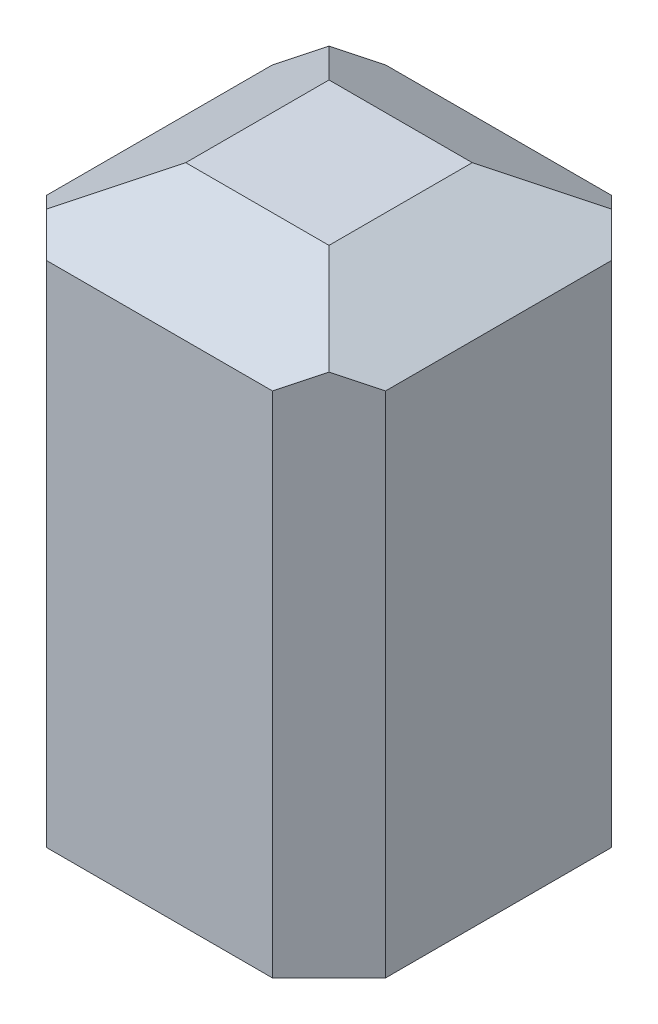
ISO-10303-21;
HEADER;
FILE_DESCRIPTION(('STEP AP214'),'2;1');
FILE_NAME('part.step','',(''),(''),'','','');
FILE_SCHEMA(('AUTOMOTIVE_DESIGN { 1 0 10303 214 1 1 1 1 }'));
ENDSEC;
DATA;
#1=APPLICATION_CONTEXT('core data for automotive mechanical design processes');
#2=APPLICATION_PROTOCOL_DEFINITION('international standard','automotive_design',2000,#1);
#3=PRODUCT_CONTEXT('',#1,'mechanical');
#4=PRODUCT('Part','Part','',(#3));
#5=PRODUCT_RELATED_PRODUCT_CATEGORY('part','',(#4));
#6=PRODUCT_DEFINITION_FORMATION('','',#4);
#7=PRODUCT_DEFINITION_CONTEXT('part definition',#1,'design');
#8=PRODUCT_DEFINITION('design','',#6,#7);
#9=PRODUCT_DEFINITION_SHAPE('','',#8);
#10=(LENGTH_UNIT() NAMED_UNIT(*) SI_UNIT(.MILLI.,.METRE.));
#11=(NAMED_UNIT(*) PLANE_ANGLE_UNIT() SI_UNIT($,.RADIAN.));
#12=(NAMED_UNIT(*) SI_UNIT($,.STERADIAN.) SOLID_ANGLE_UNIT());
#13=UNCERTAINTY_MEASURE_WITH_UNIT(LENGTH_MEASURE(1.E-05),#10,'distance_accuracy_value','');
#14=(GEOMETRIC_REPRESENTATION_CONTEXT(3) GLOBAL_UNCERTAINTY_ASSIGNED_CONTEXT((#13)) GLOBAL_UNIT_ASSIGNED_CONTEXT((#10,
#11,#12)) REPRESENTATION_CONTEXT('',''));
#15=CARTESIAN_POINT('',(0.,0.,0.));
#16=DIRECTION('',(0.,0.,1.));
#17=DIRECTION('',(1.,0.,0.));
#18=AXIS2_PLACEMENT_3D('',#15,#16,#17);
#19=CARTESIAN_POINT('',(-3.,10.,-3.));
#20=DIRECTION('',(1.,0.,0.));
#21=DIRECTION('',(0.,0.,-1.));
#22=AXIS2_PLACEMENT_3D('',#19,#20,#21);
#23=PLANE('',#22);
#24=DIRECTION('',(0.,1.,0.));
#25=VECTOR('',#24,1.);
#26=CARTESIAN_POINT('',(-3.,10.,1.99999999999999));
#27=LINE('',#26,#25);
#28=CARTESIAN_POINT('',(-3.,0.,1.99999999999999));
#29=VERTEX_POINT('',#28);
#30=CARTESIAN_POINT('',(-3.,9.,1.99999999999999));
#31=VERTEX_POINT('',#30);
#32=EDGE_CURVE('E166',#29,#31,#27,.T.);
#33=ORIENTED_EDGE('',*,*,#32,.T.);
#34=DIRECTION('',(0.,0.,-1.));
#35=VECTOR('',#34,1.);
#36=CARTESIAN_POINT('',(-3.,9.,-1.26794919243113));
#37=LINE('',#36,#35);
#38=CARTESIAN_POINT('',(-3.,9.,-2.));
#39=VERTEX_POINT('',#38);
#40=EDGE_CURVE('E47',#31,#39,#37,.T.);
#41=ORIENTED_EDGE('',*,*,#40,.T.);
#42=DIRECTION('',(0.,-1.,0.));
#43=VECTOR('',#42,1.);
#44=CARTESIAN_POINT('',(-3.,10.,-2.));
#45=LINE('',#44,#43);
#46=CARTESIAN_POINT('',(-3.,0.,-2.));
#47=VERTEX_POINT('',#46);
#48=EDGE_CURVE('E168',#39,#47,#45,.T.);
#49=ORIENTED_EDGE('',*,*,#48,.T.);
#50=DIRECTION('',(0.,0.,1.));
#51=VECTOR('',#50,1.);
#52=CARTESIAN_POINT('',(-3.,0.,-3.));
#53=LINE('',#52,#51);
#54=EDGE_CURVE('E248',#47,#29,#53,.T.);
#55=ORIENTED_EDGE('',*,*,#54,.T.);
#56=EDGE_LOOP('',(#33,#41,#49,#55));
#57=FACE_BOUND('',#56,.T.);
#58=ADVANCED_FACE('F39',(#57),#23,.F.);
#59=CARTESIAN_POINT('',(-3.,10.,3.));
#60=DIRECTION('',(0.,0.,-1.));
#61=DIRECTION('',(-1.,0.,0.));
#62=AXIS2_PLACEMENT_3D('',#59,#60,#61);
#63=PLANE('',#62);
#64=DIRECTION('',(0.,1.,0.));
#65=VECTOR('',#64,1.);
#66=CARTESIAN_POINT('',(1.99999999999999,10.,3.));
#67=LINE('',#66,#65);
#68=CARTESIAN_POINT('',(1.99999999999999,0.,3.));
#69=VERTEX_POINT('',#68);
#70=CARTESIAN_POINT('',(1.99999999999999,9.,3.));
#71=VERTEX_POINT('',#70);
#72=EDGE_CURVE('E177',#69,#71,#67,.T.);
#73=ORIENTED_EDGE('',*,*,#72,.T.);
#74=DIRECTION('',(-1.,0.,0.));
#75=VECTOR('',#74,1.);
#76=CARTESIAN_POINT('',(-1.99999999999999,9.,3.));
#77=LINE('',#76,#75);
#78=CARTESIAN_POINT('',(-1.99999999999999,9.,3.));
#79=VERTEX_POINT('',#78);
#80=EDGE_CURVE('E188',#71,#79,#77,.T.);
#81=ORIENTED_EDGE('',*,*,#80,.T.);
#82=DIRECTION('',(0.,-1.,0.));
#83=VECTOR('',#82,1.);
#84=CARTESIAN_POINT('',(-1.99999999999999,10.,3.));
#85=LINE('',#84,#83);
#86=CARTESIAN_POINT('',(-1.99999999999999,0.,3.));
#87=VERTEX_POINT('',#86);
#88=EDGE_CURVE('E164',#79,#87,#85,.T.);
#89=ORIENTED_EDGE('',*,*,#88,.T.);
#90=DIRECTION('',(1.,0.,0.));
#91=VECTOR('',#90,1.);
#92=CARTESIAN_POINT('',(-3.,0.,3.));
#93=LINE('',#92,#91);
#94=EDGE_CURVE('E157',#87,#69,#93,.T.);
#95=ORIENTED_EDGE('',*,*,#94,.T.);
#96=EDGE_LOOP('',(#73,#81,#89,#95));
#97=FACE_BOUND('',#96,.T.);
#98=ADVANCED_FACE('F245',(#97),#63,.F.);
#99=CARTESIAN_POINT('',(3.,10.,-3.));
#100=DIRECTION('',(-1.,0.,0.));
#101=DIRECTION('',(0.,0.,1.));
#102=AXIS2_PLACEMENT_3D('',#99,#100,#101);
#103=PLANE('',#102);
#104=DIRECTION('',(0.,1.,0.));
#105=VECTOR('',#104,1.);
#106=CARTESIAN_POINT('',(3.,10.,-2.));
#107=LINE('',#106,#105);
#108=CARTESIAN_POINT('',(3.,0.,-2.));
#109=VERTEX_POINT('',#108);
#110=CARTESIAN_POINT('',(3.,9.,-2.));
#111=VERTEX_POINT('',#110);
#112=EDGE_CURVE('E147',#109,#111,#107,.T.);
#113=ORIENTED_EDGE('',*,*,#112,.T.);
#114=DIRECTION('',(0.,0.,1.));
#115=VECTOR('',#114,1.);
#116=CARTESIAN_POINT('',(3.,9.,1.26794919243112));
#117=LINE('',#116,#115);
#118=CARTESIAN_POINT('',(3.,9.,1.99999999999999));
#119=VERTEX_POINT('',#118);
#120=EDGE_CURVE('E209',#111,#119,#117,.T.);
#121=ORIENTED_EDGE('',*,*,#120,.T.);
#122=DIRECTION('',(0.,-1.,0.));
#123=VECTOR('',#122,1.);
#124=CARTESIAN_POINT('',(3.,10.,1.99999999999999));
#125=LINE('',#124,#123);
#126=CARTESIAN_POINT('',(3.,0.,1.99999999999999));
#127=VERTEX_POINT('',#126);
#128=EDGE_CURVE('E175',#119,#127,#125,.T.);
#129=ORIENTED_EDGE('',*,*,#128,.T.);
#130=DIRECTION('',(0.,0.,-1.));
#131=VECTOR('',#130,1.);
#132=CARTESIAN_POINT('',(3.,0.,-3.));
#133=LINE('',#132,#131);
#134=EDGE_CURVE('E155',#127,#109,#133,.T.);
#135=ORIENTED_EDGE('',*,*,#134,.T.);
#136=EDGE_LOOP('',(#113,#121,#129,#135));
#137=FACE_BOUND('',#136,.T.);
#138=ADVANCED_FACE('F236',(#137),#103,.F.);
#139=CARTESIAN_POINT('',(-3.,10.,-3.));
#140=DIRECTION('',(0.,0.,1.));
#141=DIRECTION('',(1.,0.,0.));
#142=AXIS2_PLACEMENT_3D('',#139,#140,#141);
#143=PLANE('',#142);
#144=DIRECTION('',(0.,1.,0.));
#145=VECTOR('',#144,1.);
#146=CARTESIAN_POINT('',(-1.99999999999999,10.,-3.));
#147=LINE('',#146,#145);
#148=CARTESIAN_POINT('',(-1.99999999999999,0.,-3.));
#149=VERTEX_POINT('',#148);
#150=CARTESIAN_POINT('',(-1.99999999999999,9.,-3.));
#151=VERTEX_POINT('',#150);
#152=EDGE_CURVE('E173',#149,#151,#147,.T.);
#153=ORIENTED_EDGE('',*,*,#152,.T.);
#154=DIRECTION('',(1.,0.,0.));
#155=VECTOR('',#154,1.);
#156=CARTESIAN_POINT('',(2.,9.,-3.));
#157=LINE('',#156,#155);
#158=CARTESIAN_POINT('',(2.,9.,-3.));
#159=VERTEX_POINT('',#158);
#160=EDGE_CURVE('E136',#151,#159,#157,.T.);
#161=ORIENTED_EDGE('',*,*,#160,.T.);
#162=DIRECTION('',(0.,-1.,0.));
#163=VECTOR('',#162,1.);
#164=CARTESIAN_POINT('',(2.,10.,-3.));
#165=LINE('',#164,#163);
#166=CARTESIAN_POINT('',(2.,0.,-3.));
#167=VERTEX_POINT('',#166);
#168=EDGE_CURVE('E128',#159,#167,#165,.T.);
#169=ORIENTED_EDGE('',*,*,#168,.T.);
#170=DIRECTION('',(-1.,0.,0.));
#171=VECTOR('',#170,1.);
#172=CARTESIAN_POINT('',(-3.,0.,-3.));
#173=LINE('',#172,#171);
#174=EDGE_CURVE('E133',#167,#149,#173,.T.);
#175=ORIENTED_EDGE('',*,*,#174,.T.);
#176=EDGE_LOOP('',(#153,#161,#169,#175));
#177=FACE_BOUND('',#176,.T.);
#178=ADVANCED_FACE('F131',(#177),#143,.F.);
#179=CARTESIAN_POINT('',(-3.,10.,3.));
#180=DIRECTION('',(0.,1.,0.));
#181=DIRECTION('',(0.,0.,1.));
#182=AXIS2_PLACEMENT_3D('',#179,#180,#181);
#183=PLANE('',#182);
#184=DIRECTION('',(1.,0.,0.));
#185=VECTOR('',#184,1.);
#186=CARTESIAN_POINT('',(1.99999999999999,10.,1.26794919243112));
#187=LINE('',#186,#185);
#188=CARTESIAN_POINT('',(-1.26794919243112,10.,1.26794919243112));
#189=VERTEX_POINT('',#188);
#190=CARTESIAN_POINT('',(1.26794919243112,10.,1.26794919243112));
#191=VERTEX_POINT('',#190);
#192=EDGE_CURVE('E183',#189,#191,#187,.T.);
#193=ORIENTED_EDGE('',*,*,#192,.T.);
#194=DIRECTION('',(0.,0.,-1.));
#195=VECTOR('',#194,1.);
#196=CARTESIAN_POINT('',(1.26794919243113,10.,-1.26794919243113));
#197=LINE('',#196,#195);
#198=CARTESIAN_POINT('',(1.26794919243113,10.,-1.26794919243113));
#199=VERTEX_POINT('',#198);
#200=EDGE_CURVE('E200',#191,#199,#197,.T.);
#201=ORIENTED_EDGE('',*,*,#200,.T.);
#202=DIRECTION('',(-1.,0.,0.));
#203=VECTOR('',#202,1.);
#204=CARTESIAN_POINT('',(-1.99999999999999,10.,-1.26794919243113));
#205=LINE('',#204,#203);
#206=CARTESIAN_POINT('',(-1.26794919243112,10.,-1.26794919243113));
#207=VERTEX_POINT('',#206);
#208=EDGE_CURVE('E180',#199,#207,#205,.T.);
#209=ORIENTED_EDGE('',*,*,#208,.T.);
#210=DIRECTION('',(0.,0.,1.));
#211=VECTOR('',#210,1.);
#212=CARTESIAN_POINT('',(-1.26794919243112,10.,1.26794919243112));
#213=LINE('',#212,#211);
#214=EDGE_CURVE('E197',#207,#189,#213,.T.);
#215=ORIENTED_EDGE('',*,*,#214,.T.);
#216=EDGE_LOOP('',(#193,#201,#209,#215));
#217=FACE_BOUND('',#216,.T.);
#218=ADVANCED_FACE('F227',(#217),#183,.T.);
#219=CARTESIAN_POINT('',(-3.,0.,3.));
#220=DIRECTION('',(0.,1.,0.));
#221=DIRECTION('',(0.,0.,1.));
#222=AXIS2_PLACEMENT_3D('',#219,#220,#221);
#223=PLANE('',#222);
#224=ORIENTED_EDGE('',*,*,#54,.F.);
#225=DIRECTION('',(-0.707106781186548,0.,0.707106781186548));
#226=VECTOR('',#225,1.);
#227=CARTESIAN_POINT('',(-3.,0.,-2.));
#228=LINE('',#227,#226);
#229=EDGE_CURVE('E154',#47,#149,#228,.F.);
#230=ORIENTED_EDGE('',*,*,#229,.T.);
#231=ORIENTED_EDGE('',*,*,#174,.F.);
#232=DIRECTION('',(-0.707106781186548,0.,-0.707106781186547));
#233=VECTOR('',#232,1.);
#234=CARTESIAN_POINT('',(2.,0.,-3.));
#235=LINE('',#234,#233);
#236=EDGE_CURVE('E144',#167,#109,#235,.F.);
#237=ORIENTED_EDGE('',*,*,#236,.T.);
#238=ORIENTED_EDGE('',*,*,#134,.F.);
#239=DIRECTION('',(0.707106781186548,0.,-0.707106781186547));
#240=VECTOR('',#239,1.);
#241=CARTESIAN_POINT('',(3.,0.,1.99999999999999));
#242=LINE('',#241,#240);
#243=EDGE_CURVE('E170',#127,#69,#242,.F.);
#244=ORIENTED_EDGE('',*,*,#243,.T.);
#245=ORIENTED_EDGE('',*,*,#94,.F.);
#246=DIRECTION('',(0.707106781186548,0.,0.707106781186548));
#247=VECTOR('',#246,1.);
#248=CARTESIAN_POINT('',(-1.99999999999999,0.,3.));
#249=LINE('',#248,#247);
#250=EDGE_CURVE('E140',#87,#29,#249,.F.);
#251=ORIENTED_EDGE('',*,*,#250,.T.);
#252=EDGE_LOOP('',(#224,#230,#231,#237,#238,#244,#245,#251));
#253=FACE_BOUND('',#252,.T.);
#254=ADVANCED_FACE('F152',(#253),#223,.F.);
#255=CARTESIAN_POINT('',(2.,10.,-3.));
#256=DIRECTION('',(-0.707106781186547,0.,0.707106781186548));
#257=DIRECTION('',(0.707106781186548,0.,0.707106781186547));
#258=AXIS2_PLACEMENT_3D('',#255,#256,#257);
#259=PLANE('',#258);
#260=DIRECTION('',(-0.654653670707977,-0.377964473009228,-0.654653670707977));
#261=VECTOR('',#260,1.);
#262=CARTESIAN_POINT('',(2.2474358296527,9.14285714285714,-2.75256417034731));
#263=LINE('',#262,#261);
#264=CARTESIAN_POINT('',(2.5,9.28867513459481,-2.5));
#265=VERTEX_POINT('',#264);
#266=EDGE_CURVE('E195',#159,#265,#263,.F.);
#267=ORIENTED_EDGE('',*,*,#266,.T.);
#268=DIRECTION('',(-0.654653670707977,0.377964473009229,-0.654653670707977));
#269=VECTOR('',#268,1.);
#270=CARTESIAN_POINT('',(1.89542131320445,9.63772880216254,-3.10457868679556));
#271=LINE('',#270,#269);
#272=EDGE_CURVE('E207',#265,#111,#271,.F.);
#273=ORIENTED_EDGE('',*,*,#272,.T.);
#274=ORIENTED_EDGE('',*,*,#112,.F.);
#275=ORIENTED_EDGE('',*,*,#236,.F.);
#276=ORIENTED_EDGE('',*,*,#168,.F.);
#277=EDGE_LOOP('',(#267,#273,#274,#275,#276));
#278=FACE_BOUND('',#277,.T.);
#279=ADVANCED_FACE('F145',(#278),#259,.F.);
#280=CARTESIAN_POINT('',(-1.99999999999999,10.,3.));
#281=DIRECTION('',(0.707106781186548,0.,-0.707106781186548));
#282=DIRECTION('',(-0.707106781186548,0.,-0.707106781186548));
#283=AXIS2_PLACEMENT_3D('',#280,#281,#282);
#284=PLANE('',#283);
#285=DIRECTION('',(0.654653670707977,-0.377964473009228,0.654653670707977));
#286=VECTOR('',#285,1.);
#287=CARTESIAN_POINT('',(-2.24743582965269,9.14285714285714,2.7525641703473));
#288=LINE('',#287,#286);
#289=CARTESIAN_POINT('',(-2.49999999999999,9.28867513459481,2.5));
#290=VERTEX_POINT('',#289);
#291=EDGE_CURVE('E190',#79,#290,#288,.F.);
#292=ORIENTED_EDGE('',*,*,#291,.T.);
#293=DIRECTION('',(0.654653670707977,0.377964473009228,0.654653670707977));
#294=VECTOR('',#293,1.);
#295=CARTESIAN_POINT('',(-1.89542131320444,9.63772880216254,3.10457868679555));
#296=LINE('',#295,#294);
#297=EDGE_CURVE('E61',#290,#31,#296,.F.);
#298=ORIENTED_EDGE('',*,*,#297,.T.);
#299=ORIENTED_EDGE('',*,*,#32,.F.);
#300=ORIENTED_EDGE('',*,*,#250,.F.);
#301=ORIENTED_EDGE('',*,*,#88,.F.);
#302=EDGE_LOOP('',(#292,#298,#299,#300,#301));
#303=FACE_BOUND('',#302,.T.);
#304=ADVANCED_FACE('F250',(#303),#284,.F.);
#305=CARTESIAN_POINT('',(-3.,10.,-2.));
#306=DIRECTION('',(0.707106781186548,0.,0.707106781186548));
#307=DIRECTION('',(0.707106781186548,0.,-0.707106781186548));
#308=AXIS2_PLACEMENT_3D('',#305,#306,#307);
#309=PLANE('',#308);
#310=ORIENTED_EDGE('',*,*,#48,.F.);
#311=DIRECTION('',(-0.654653670707977,-0.377964473009228,0.654653670707977));
#312=VECTOR('',#311,1.);
#313=CARTESIAN_POINT('',(-2.7525641703473,9.14285714285714,-2.2474358296527));
#314=LINE('',#313,#312);
#315=CARTESIAN_POINT('',(-2.49999999999999,9.28867513459481,-2.5));
#316=VERTEX_POINT('',#315);
#317=EDGE_CURVE('E11',#39,#316,#314,.F.);
#318=ORIENTED_EDGE('',*,*,#317,.T.);
#319=DIRECTION('',(-0.654653670707977,0.377964473009228,0.654653670707977));
#320=VECTOR('',#319,1.);
#321=CARTESIAN_POINT('',(-3.10457868679555,9.63772880216254,-1.89542131320445));
#322=LINE('',#321,#320);
#323=EDGE_CURVE('E192',#316,#151,#322,.F.);
#324=ORIENTED_EDGE('',*,*,#323,.T.);
#325=ORIENTED_EDGE('',*,*,#152,.F.);
#326=ORIENTED_EDGE('',*,*,#229,.F.);
#327=EDGE_LOOP('',(#310,#318,#324,#325,#326));
#328=FACE_BOUND('',#327,.T.);
#329=ADVANCED_FACE('F253',(#328),#309,.F.);
#330=CARTESIAN_POINT('',(3.,10.,1.99999999999999));
#331=DIRECTION('',(-0.707106781186547,0.,-0.707106781186548));
#332=DIRECTION('',(-0.707106781186548,0.,0.707106781186547));
#333=AXIS2_PLACEMENT_3D('',#330,#331,#332);
#334=PLANE('',#333);
#335=ORIENTED_EDGE('',*,*,#128,.F.);
#336=DIRECTION('',(0.654653670707977,-0.377964473009228,-0.654653670707976));
#337=VECTOR('',#336,1.);
#338=CARTESIAN_POINT('',(2.7525641703473,9.14285714285714,2.24743582965269));
#339=LINE('',#338,#337);
#340=CARTESIAN_POINT('',(2.49999999999999,9.28867513459481,2.5));
#341=VERTEX_POINT('',#340);
#342=EDGE_CURVE('E211',#119,#341,#339,.F.);
#343=ORIENTED_EDGE('',*,*,#342,.T.);
#344=DIRECTION('',(0.654653670707978,0.377964473009228,-0.654653670707977));
#345=VECTOR('',#344,1.);
#346=CARTESIAN_POINT('',(3.10457868679555,9.63772880216254,1.89542131320444));
#347=LINE('',#346,#345);
#348=EDGE_CURVE('E186',#341,#71,#347,.F.);
#349=ORIENTED_EDGE('',*,*,#348,.T.);
#350=ORIENTED_EDGE('',*,*,#72,.F.);
#351=ORIENTED_EDGE('',*,*,#243,.F.);
#352=EDGE_LOOP('',(#335,#343,#349,#350,#351));
#353=FACE_BOUND('',#352,.T.);
#354=ADVANCED_FACE('F239',(#353),#334,.F.);
#355=CARTESIAN_POINT('',(-3.,10.,1.26794919243112));
#356=DIRECTION('',(0.,0.866025403784438,0.500000000000001));
#357=DIRECTION('',(0.,-0.500000000000001,0.866025403784438));
#358=AXIS2_PLACEMENT_3D('',#355,#356,#357);
#359=PLANE('',#358);
#360=ORIENTED_EDGE('',*,*,#348,.F.);
#361=DIRECTION('',(-0.654653670707976,0.377964473009228,-0.654653670707977));
#362=VECTOR('',#361,1.);
#363=CARTESIAN_POINT('',(-0.561171890039352,11.0560435493448,-0.561171890039354));
#364=LINE('',#363,#362);
#365=EDGE_CURVE('E215',#341,#191,#364,.T.);
#366=ORIENTED_EDGE('',*,*,#365,.T.);
#367=ORIENTED_EDGE('',*,*,#192,.F.);
#368=DIRECTION('',(-0.654653670707977,-0.377964473009228,0.654653670707977));
#369=VECTOR('',#368,1.);
#370=CARTESIAN_POINT('',(-2.01025668138921,9.57142857142857,2.01025668138921));
#371=LINE('',#370,#369);
#372=EDGE_CURVE('E213',#189,#290,#371,.T.);
#373=ORIENTED_EDGE('',*,*,#372,.T.);
#374=ORIENTED_EDGE('',*,*,#291,.F.);
#375=ORIENTED_EDGE('',*,*,#80,.F.);
#376=EDGE_LOOP('',(#360,#366,#367,#373,#374,#375));
#377=FACE_BOUND('',#376,.T.);
#378=ADVANCED_FACE('F221',(#377),#359,.T.);
#379=CARTESIAN_POINT('',(-3.,10.,-1.26794919243113));
#380=DIRECTION('',(0.,0.866025403784438,-0.500000000000001));
#381=DIRECTION('',(0.,0.500000000000001,0.866025403784438));
#382=AXIS2_PLACEMENT_3D('',#379,#380,#381);
#383=PLANE('',#382);
#384=ORIENTED_EDGE('',*,*,#208,.F.);
#385=DIRECTION('',(0.654653670707977,-0.377964473009228,-0.654653670707977));
#386=VECTOR('',#385,1.);
#387=CARTESIAN_POINT('',(-0.561171890039355,11.0560435493448,0.561171890039351));
#388=LINE('',#387,#386);
#389=EDGE_CURVE('E205',#199,#265,#388,.T.);
#390=ORIENTED_EDGE('',*,*,#389,.T.);
#391=ORIENTED_EDGE('',*,*,#266,.F.);
#392=ORIENTED_EDGE('',*,*,#160,.F.);
#393=ORIENTED_EDGE('',*,*,#323,.F.);
#394=DIRECTION('',(0.654653670707977,0.377964473009228,0.654653670707977));
#395=VECTOR('',#394,1.);
#396=CARTESIAN_POINT('',(-2.01025668138921,9.57142857142857,-2.01025668138922));
#397=LINE('',#396,#395);
#398=EDGE_CURVE('E203',#316,#207,#397,.T.);
#399=ORIENTED_EDGE('',*,*,#398,.T.);
#400=EDGE_LOOP('',(#384,#390,#391,#392,#393,#399));
#401=FACE_BOUND('',#400,.T.);
#402=ADVANCED_FACE('F234',(#401),#383,.T.);
#403=CARTESIAN_POINT('',(1.26794919243112,10.,3.));
#404=DIRECTION('',(0.500000000000001,0.866025403784438,0.));
#405=DIRECTION('',(-0.866025403784438,0.500000000000001,0.));
#406=AXIS2_PLACEMENT_3D('',#403,#404,#405);
#407=PLANE('',#406);
#408=ORIENTED_EDGE('',*,*,#342,.F.);
#409=ORIENTED_EDGE('',*,*,#120,.F.);
#410=ORIENTED_EDGE('',*,*,#272,.F.);
#411=ORIENTED_EDGE('',*,*,#389,.F.);
#412=ORIENTED_EDGE('',*,*,#200,.F.);
#413=ORIENTED_EDGE('',*,*,#365,.F.);
#414=EDGE_LOOP('',(#408,#409,#410,#411,#412,#413));
#415=FACE_BOUND('',#414,.T.);
#416=ADVANCED_FACE('F230',(#415),#407,.T.);
#417=CARTESIAN_POINT('',(-1.26794919243112,10.,3.));
#418=DIRECTION('',(-0.500000000000001,0.866025403784438,0.));
#419=DIRECTION('',(-0.866025403784438,-0.500000000000001,0.));
#420=AXIS2_PLACEMENT_3D('',#417,#418,#419);
#421=PLANE('',#420);
#422=ORIENTED_EDGE('',*,*,#317,.F.);
#423=ORIENTED_EDGE('',*,*,#40,.F.);
#424=ORIENTED_EDGE('',*,*,#297,.F.);
#425=ORIENTED_EDGE('',*,*,#372,.F.);
#426=ORIENTED_EDGE('',*,*,#214,.F.);
#427=ORIENTED_EDGE('',*,*,#398,.F.);
#428=EDGE_LOOP('',(#422,#423,#424,#425,#426,#427));
#429=FACE_BOUND('',#428,.T.);
#430=ADVANCED_FACE('F41',(#429),#421,.T.);
#431=CLOSED_SHELL('',(#58,#98,#138,#178,#218,#254,#279,#304,#329,#354,#378,#402,#416,#430));
#432=MANIFOLD_SOLID_BREP('B2',#431);
#433=ADVANCED_BREP_SHAPE_REPRESENTATION('',(#18,#432),#14);
#434=SHAPE_DEFINITION_REPRESENTATION(#9,#433);
ENDSEC;
END-ISO-10303-21;
